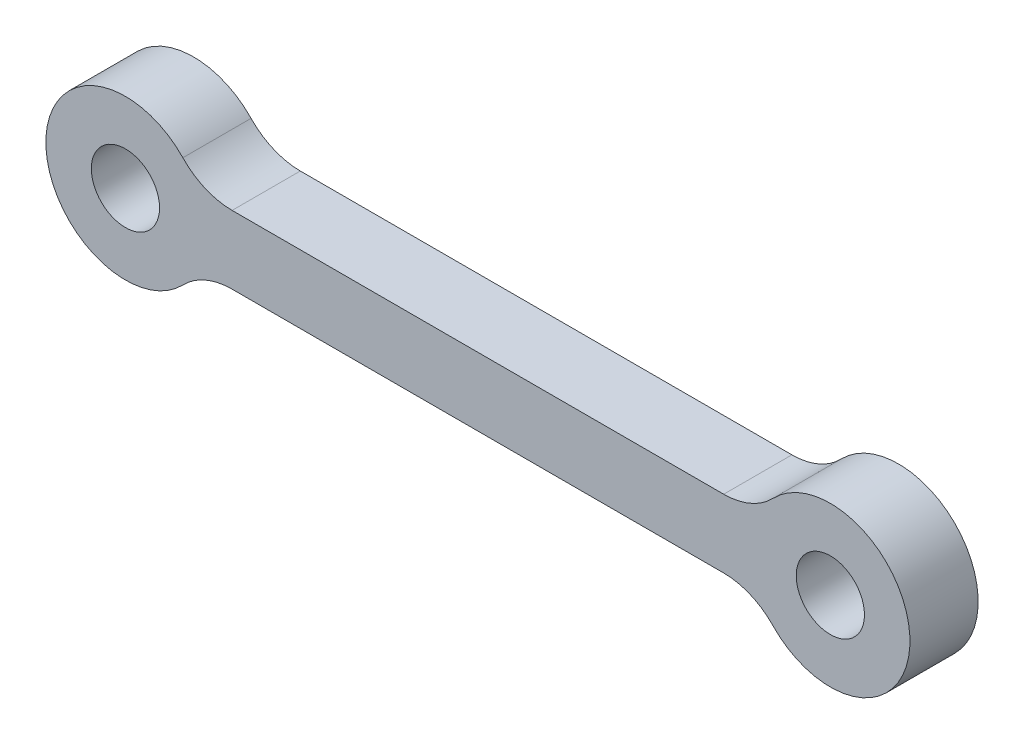
ISO-10303-21;
HEADER;
FILE_DESCRIPTION(('STEP AP214'),'2;1');
FILE_NAME('part.step','',(''),(''),'','','');
FILE_SCHEMA(('AUTOMOTIVE_DESIGN { 1 0 10303 214 1 1 1 1 }'));
ENDSEC;
DATA;
#1=APPLICATION_CONTEXT('core data for automotive mechanical design processes');
#2=APPLICATION_PROTOCOL_DEFINITION('international standard','automotive_design',2000,#1);
#3=PRODUCT_CONTEXT('',#1,'mechanical');
#4=PRODUCT('Part','Part','',(#3));
#5=PRODUCT_RELATED_PRODUCT_CATEGORY('part','',(#4));
#6=PRODUCT_DEFINITION_FORMATION('','',#4);
#7=PRODUCT_DEFINITION_CONTEXT('part definition',#1,'design');
#8=PRODUCT_DEFINITION('design','',#6,#7);
#9=PRODUCT_DEFINITION_SHAPE('','',#8);
#10=(LENGTH_UNIT() NAMED_UNIT(*) SI_UNIT(.MILLI.,.METRE.));
#11=(NAMED_UNIT(*) PLANE_ANGLE_UNIT() SI_UNIT($,.RADIAN.));
#12=(NAMED_UNIT(*) SI_UNIT($,.STERADIAN.) SOLID_ANGLE_UNIT());
#13=UNCERTAINTY_MEASURE_WITH_UNIT(LENGTH_MEASURE(1.E-05),#10,'distance_accuracy_value','');
#14=(GEOMETRIC_REPRESENTATION_CONTEXT(3) GLOBAL_UNCERTAINTY_ASSIGNED_CONTEXT((#13)) GLOBAL_UNIT_ASSIGNED_CONTEXT((#10,
#11,#12)) REPRESENTATION_CONTEXT('',''));
#15=CARTESIAN_POINT('',(0.,0.,0.));
#16=DIRECTION('',(0.,0.,1.));
#17=DIRECTION('',(1.,0.,0.));
#18=AXIS2_PLACEMENT_3D('',#15,#16,#17);
#19=CARTESIAN_POINT('',(0.,-1.5,3.));
#20=DIRECTION('',(0.,-1.,0.));
#21=DIRECTION('',(1.,0.,0.));
#22=AXIS2_PLACEMENT_3D('',#19,#20,#21);
#23=PLANE('',#22);
#24=DIRECTION('',(-1.,0.,0.));
#25=VECTOR('',#24,1.);
#26=CARTESIAN_POINT('',(0.,-1.5,0.));
#27=LINE('',#26,#25);
#28=CARTESIAN_POINT('',(10.8095842401766,-1.5,0.));
#29=VERTEX_POINT('',#28);
#30=CARTESIAN_POINT('',(-10.8095842401766,-1.5,0.));
#31=VERTEX_POINT('',#30);
#32=EDGE_CURVE('E136',#29,#31,#27,.T.);
#33=ORIENTED_EDGE('',*,*,#32,.F.);
#34=DIRECTION('',(0.,0.,-1.));
#35=VECTOR('',#34,1.);
#36=CARTESIAN_POINT('',(10.8095842401766,-1.5,3.));
#37=LINE('',#36,#35);
#38=CARTESIAN_POINT('',(10.8095842401766,-1.5,3.));
#39=VERTEX_POINT('',#38);
#40=EDGE_CURVE('E58',#29,#39,#37,.F.);
#41=ORIENTED_EDGE('',*,*,#40,.T.);
#42=DIRECTION('',(-1.,0.,0.));
#43=VECTOR('',#42,1.);
#44=CARTESIAN_POINT('',(0.,-1.5,3.));
#45=LINE('',#44,#43);
#46=CARTESIAN_POINT('',(-10.8095842401766,-1.5,3.));
#47=VERTEX_POINT('',#46);
#48=EDGE_CURVE('E145',#39,#47,#45,.T.);
#49=ORIENTED_EDGE('',*,*,#48,.T.);
#50=DIRECTION('',(0.,0.,-1.));
#51=VECTOR('',#50,1.);
#52=CARTESIAN_POINT('',(-10.8095842401766,-1.5,3.));
#53=LINE('',#52,#51);
#54=EDGE_CURVE('E156',#47,#31,#53,.T.);
#55=ORIENTED_EDGE('',*,*,#54,.T.);
#56=EDGE_LOOP('',(#33,#41,#49,#55));
#57=FACE_BOUND('',#56,.T.);
#58=ADVANCED_FACE('F38',(#57),#23,.T.);
#59=CARTESIAN_POINT('',(15.5,0.,3.));
#60=DIRECTION('',(0.,0.,-1.));
#61=DIRECTION('',(-1.,0.,0.));
#62=AXIS2_PLACEMENT_3D('',#59,#60,#61);
#63=CYLINDRICAL_SURFACE('',#62,3.5);
#64=CARTESIAN_POINT('',(15.5,0.,0.));
#65=DIRECTION('',(0.,0.,1.));
#66=DIRECTION('',(1.,0.,0.));
#67=AXIS2_PLACEMENT_3D('',#64,#65,#66);
#68=CIRCLE('',#67,3.5);
#69=CARTESIAN_POINT('',(12.9743915139412,-2.42307692307692,0.));
#70=VERTEX_POINT('',#69);
#71=CARTESIAN_POINT('',(12.9743915139412,2.42307692307692,0.));
#72=VERTEX_POINT('',#71);
#73=EDGE_CURVE('E131',#70,#72,#68,.T.);
#74=ORIENTED_EDGE('',*,*,#73,.T.);
#75=DIRECTION('',(0.,0.,-1.));
#76=VECTOR('',#75,1.);
#77=CARTESIAN_POINT('',(12.9743915139412,2.42307692307692,3.));
#78=LINE('',#77,#76);
#79=CARTESIAN_POINT('',(12.9743915139412,2.42307692307692,3.));
#80=VERTEX_POINT('',#79);
#81=EDGE_CURVE('E108',#72,#80,#78,.F.);
#82=ORIENTED_EDGE('',*,*,#81,.T.);
#83=CARTESIAN_POINT('',(15.5,0.,3.));
#84=DIRECTION('',(0.,0.,1.));
#85=DIRECTION('',(1.,0.,0.));
#86=AXIS2_PLACEMENT_3D('',#83,#84,#85);
#87=CIRCLE('',#86,3.5);
#88=CARTESIAN_POINT('',(12.9743915139412,-2.42307692307692,3.));
#89=VERTEX_POINT('',#88);
#90=EDGE_CURVE('E176',#89,#80,#87,.T.);
#91=ORIENTED_EDGE('',*,*,#90,.F.);
#92=DIRECTION('',(0.,0.,-1.));
#93=VECTOR('',#92,1.);
#94=CARTESIAN_POINT('',(12.9743915139412,-2.42307692307692,3.));
#95=LINE('',#94,#93);
#96=EDGE_CURVE('E123',#89,#70,#95,.T.);
#97=ORIENTED_EDGE('',*,*,#96,.T.);
#98=EDGE_LOOP('',(#74,#82,#91,#97));
#99=FACE_BOUND('',#98,.T.);
#100=ADVANCED_FACE('F204',(#99),#63,.T.);
#101=CARTESIAN_POINT('',(0.,1.5,3.));
#102=DIRECTION('',(0.,-1.,0.));
#103=DIRECTION('',(1.,0.,0.));
#104=AXIS2_PLACEMENT_3D('',#101,#102,#103);
#105=PLANE('',#104);
#106=DIRECTION('',(-1.,0.,0.));
#107=VECTOR('',#106,1.);
#108=CARTESIAN_POINT('',(0.,1.5,3.));
#109=LINE('',#108,#107);
#110=CARTESIAN_POINT('',(10.8095842401766,1.5,3.));
#111=VERTEX_POINT('',#110);
#112=CARTESIAN_POINT('',(-10.8095842401766,1.5,3.));
#113=VERTEX_POINT('',#112);
#114=EDGE_CURVE('E122',#111,#113,#109,.T.);
#115=ORIENTED_EDGE('',*,*,#114,.F.);
#116=DIRECTION('',(0.,0.,1.));
#117=VECTOR('',#116,1.);
#118=CARTESIAN_POINT('',(10.8095842401766,1.5,0.));
#119=LINE('',#118,#117);
#120=CARTESIAN_POINT('',(10.8095842401766,1.5,0.));
#121=VERTEX_POINT('',#120);
#122=EDGE_CURVE('E107',#111,#121,#119,.F.);
#123=ORIENTED_EDGE('',*,*,#122,.T.);
#124=DIRECTION('',(-1.,0.,0.));
#125=VECTOR('',#124,1.);
#126=CARTESIAN_POINT('',(0.,1.5,0.));
#127=LINE('',#126,#125);
#128=CARTESIAN_POINT('',(-10.8095842401766,1.5,0.));
#129=VERTEX_POINT('',#128);
#130=EDGE_CURVE('E119',#121,#129,#127,.T.);
#131=ORIENTED_EDGE('',*,*,#130,.T.);
#132=DIRECTION('',(0.,0.,1.));
#133=VECTOR('',#132,1.);
#134=CARTESIAN_POINT('',(-10.8095842401766,1.5,3.));
#135=LINE('',#134,#133);
#136=EDGE_CURVE('E124',#129,#113,#135,.T.);
#137=ORIENTED_EDGE('',*,*,#136,.T.);
#138=EDGE_LOOP('',(#115,#123,#131,#137));
#139=FACE_BOUND('',#138,.T.);
#140=ADVANCED_FACE('F118',(#139),#105,.F.);
#141=CARTESIAN_POINT('',(-15.5,0.,3.));
#142=DIRECTION('',(0.,0.,-1.));
#143=DIRECTION('',(-1.,0.,0.));
#144=AXIS2_PLACEMENT_3D('',#141,#142,#143);
#145=CYLINDRICAL_SURFACE('',#144,1.5);
#146=CARTESIAN_POINT('',(-15.5,0.,3.));
#147=DIRECTION('',(0.,0.,1.));
#148=DIRECTION('',(1.,0.,0.));
#149=AXIS2_PLACEMENT_3D('',#146,#147,#148);
#150=CIRCLE('',#149,1.5);
#151=CARTESIAN_POINT('',(-14.,0.,3.));
#152=VERTEX_POINT('',#151);
#153=EDGE_CURVE('E184',#152,#152,#150,.T.);
#154=ORIENTED_EDGE('',*,*,#153,.T.);
#155=EDGE_LOOP('',(#154));
#156=FACE_BOUND('',#155,.T.);
#157=CARTESIAN_POINT('',(-15.5,0.,0.));
#158=DIRECTION('',(0.,0.,1.));
#159=DIRECTION('',(1.,0.,0.));
#160=AXIS2_PLACEMENT_3D('',#157,#158,#159);
#161=CIRCLE('',#160,1.5);
#162=CARTESIAN_POINT('',(-14.,0.,0.));
#163=VERTEX_POINT('',#162);
#164=EDGE_CURVE('E134',#163,#163,#161,.T.);
#165=ORIENTED_EDGE('',*,*,#164,.F.);
#166=EDGE_LOOP('',(#165));
#167=FACE_BOUND('',#166,.T.);
#168=ADVANCED_FACE('F265',(#156,#167),#145,.F.);
#169=CARTESIAN_POINT('',(-15.5,0.,3.));
#170=DIRECTION('',(0.,0.,-1.));
#171=DIRECTION('',(-1.,0.,0.));
#172=AXIS2_PLACEMENT_3D('',#169,#170,#171);
#173=CYLINDRICAL_SURFACE('',#172,3.5);
#174=CARTESIAN_POINT('',(-15.5,0.,3.));
#175=DIRECTION('',(0.,0.,1.));
#176=DIRECTION('',(1.,0.,0.));
#177=AXIS2_PLACEMENT_3D('',#174,#175,#176);
#178=CIRCLE('',#177,3.5);
#179=CARTESIAN_POINT('',(-12.9743915139412,2.42307692307692,3.));
#180=VERTEX_POINT('',#179);
#181=CARTESIAN_POINT('',(-12.9743915139412,-2.42307692307693,3.));
#182=VERTEX_POINT('',#181);
#183=EDGE_CURVE('E182',#180,#182,#178,.T.);
#184=ORIENTED_EDGE('',*,*,#183,.F.);
#185=DIRECTION('',(0.,0.,-1.));
#186=VECTOR('',#185,1.);
#187=CARTESIAN_POINT('',(-12.9743915139412,2.42307692307692,3.));
#188=LINE('',#187,#186);
#189=CARTESIAN_POINT('',(-12.9743915139412,2.42307692307692,0.));
#190=VERTEX_POINT('',#189);
#191=EDGE_CURVE('E153',#180,#190,#188,.T.);
#192=ORIENTED_EDGE('',*,*,#191,.T.);
#193=CARTESIAN_POINT('',(-15.5,0.,0.));
#194=DIRECTION('',(0.,0.,1.));
#195=DIRECTION('',(1.,0.,0.));
#196=AXIS2_PLACEMENT_3D('',#193,#194,#195);
#197=CIRCLE('',#196,3.5);
#198=CARTESIAN_POINT('',(-12.9743915139412,-2.42307692307693,0.));
#199=VERTEX_POINT('',#198);
#200=EDGE_CURVE('E130',#190,#199,#197,.T.);
#201=ORIENTED_EDGE('',*,*,#200,.T.);
#202=DIRECTION('',(0.,0.,-1.));
#203=VECTOR('',#202,1.);
#204=CARTESIAN_POINT('',(-12.9743915139412,-2.42307692307693,3.));
#205=LINE('',#204,#203);
#206=EDGE_CURVE('E151',#199,#182,#205,.F.);
#207=ORIENTED_EDGE('',*,*,#206,.T.);
#208=EDGE_LOOP('',(#184,#192,#201,#207));
#209=FACE_BOUND('',#208,.T.);
#210=ADVANCED_FACE('F173',(#209),#173,.T.);
#211=CARTESIAN_POINT('',(15.5,0.,3.));
#212=DIRECTION('',(0.,0.,-1.));
#213=DIRECTION('',(-1.,0.,0.));
#214=AXIS2_PLACEMENT_3D('',#211,#212,#213);
#215=CYLINDRICAL_SURFACE('',#214,1.5);
#216=CARTESIAN_POINT('',(15.5,0.,3.));
#217=DIRECTION('',(0.,0.,1.));
#218=DIRECTION('',(1.,0.,0.));
#219=AXIS2_PLACEMENT_3D('',#216,#217,#218);
#220=CIRCLE('',#219,1.5);
#221=CARTESIAN_POINT('',(17.,0.,3.));
#222=VERTEX_POINT('',#221);
#223=EDGE_CURVE('E146',#222,#222,#220,.T.);
#224=ORIENTED_EDGE('',*,*,#223,.T.);
#225=EDGE_LOOP('',(#224));
#226=FACE_BOUND('',#225,.T.);
#227=CARTESIAN_POINT('',(15.5,0.,0.));
#228=DIRECTION('',(0.,0.,1.));
#229=DIRECTION('',(1.,0.,0.));
#230=AXIS2_PLACEMENT_3D('',#227,#228,#229);
#231=CIRCLE('',#230,1.5);
#232=CARTESIAN_POINT('',(17.,0.,0.));
#233=VERTEX_POINT('',#232);
#234=EDGE_CURVE('E142',#233,#233,#231,.T.);
#235=ORIENTED_EDGE('',*,*,#234,.F.);
#236=EDGE_LOOP('',(#235));
#237=FACE_BOUND('',#236,.T.);
#238=ADVANCED_FACE('F190',(#226,#237),#215,.F.);
#239=CARTESIAN_POINT('',(0.,0.,3.));
#240=DIRECTION('',(0.,0.,1.));
#241=DIRECTION('',(1.,0.,0.));
#242=AXIS2_PLACEMENT_3D('',#239,#240,#241);
#243=PLANE('',#242);
#244=ORIENTED_EDGE('',*,*,#48,.F.);
#245=CARTESIAN_POINT('',(10.8095842401766,-4.5,3.));
#246=DIRECTION('',(0.,0.,1.));
#247=DIRECTION('',(1.,0.,0.));
#248=AXIS2_PLACEMENT_3D('',#245,#246,#247);
#249=CIRCLE('',#248,3.);
#250=EDGE_CURVE('E166',#39,#89,#249,.F.);
#251=ORIENTED_EDGE('',*,*,#250,.T.);
#252=ORIENTED_EDGE('',*,*,#90,.T.);
#253=CARTESIAN_POINT('',(10.8095842401766,4.5,3.));
#254=DIRECTION('',(0.,0.,1.));
#255=DIRECTION('',(1.,0.,0.));
#256=AXIS2_PLACEMENT_3D('',#253,#254,#255);
#257=CIRCLE('',#256,3.);
#258=EDGE_CURVE('E113',#80,#111,#257,.F.);
#259=ORIENTED_EDGE('',*,*,#258,.T.);
#260=ORIENTED_EDGE('',*,*,#114,.T.);
#261=CARTESIAN_POINT('',(-10.8095842401766,4.5,3.));
#262=DIRECTION('',(0.,0.,1.));
#263=DIRECTION('',(1.,0.,0.));
#264=AXIS2_PLACEMENT_3D('',#261,#262,#263);
#265=CIRCLE('',#264,3.);
#266=EDGE_CURVE('E162',#113,#180,#265,.F.);
#267=ORIENTED_EDGE('',*,*,#266,.T.);
#268=ORIENTED_EDGE('',*,*,#183,.T.);
#269=CARTESIAN_POINT('',(-10.8095842401766,-4.5,3.));
#270=DIRECTION('',(0.,0.,1.));
#271=DIRECTION('',(1.,0.,0.));
#272=AXIS2_PLACEMENT_3D('',#269,#270,#271);
#273=CIRCLE('',#272,3.);
#274=EDGE_CURVE('E11',#182,#47,#273,.F.);
#275=ORIENTED_EDGE('',*,*,#274,.T.);
#276=EDGE_LOOP('',(#244,#251,#252,#259,#260,#267,#268,#275));
#277=FACE_BOUND('',#276,.T.);
#278=ORIENTED_EDGE('',*,*,#153,.F.);
#279=EDGE_LOOP('',(#278));
#280=FACE_BOUND('',#279,.T.);
#281=ORIENTED_EDGE('',*,*,#223,.F.);
#282=EDGE_LOOP('',(#281));
#283=FACE_BOUND('',#282,.T.);
#284=ADVANCED_FACE('F193',(#277,#280,#283),#243,.T.);
#285=CARTESIAN_POINT('',(0.,0.,0.));
#286=DIRECTION('',(0.,0.,1.));
#287=DIRECTION('',(1.,0.,0.));
#288=AXIS2_PLACEMENT_3D('',#285,#286,#287);
#289=PLANE('',#288);
#290=ORIENTED_EDGE('',*,*,#73,.F.);
#291=CARTESIAN_POINT('',(10.8095842401766,-4.5,0.));
#292=DIRECTION('',(0.,0.,1.));
#293=DIRECTION('',(1.,0.,0.));
#294=AXIS2_PLACEMENT_3D('',#291,#292,#293);
#295=CIRCLE('',#294,3.);
#296=EDGE_CURVE('E164',#70,#29,#295,.T.);
#297=ORIENTED_EDGE('',*,*,#296,.T.);
#298=ORIENTED_EDGE('',*,*,#32,.T.);
#299=CARTESIAN_POINT('',(-10.8095842401766,-4.5,0.));
#300=DIRECTION('',(0.,0.,1.));
#301=DIRECTION('',(1.,0.,0.));
#302=AXIS2_PLACEMENT_3D('',#299,#300,#301);
#303=CIRCLE('',#302,3.);
#304=EDGE_CURVE('E46',#31,#199,#303,.T.);
#305=ORIENTED_EDGE('',*,*,#304,.T.);
#306=ORIENTED_EDGE('',*,*,#200,.F.);
#307=CARTESIAN_POINT('',(-10.8095842401766,4.5,0.));
#308=DIRECTION('',(0.,0.,1.));
#309=DIRECTION('',(1.,0.,0.));
#310=AXIS2_PLACEMENT_3D('',#307,#308,#309);
#311=CIRCLE('',#310,3.);
#312=EDGE_CURVE('E129',#190,#129,#311,.T.);
#313=ORIENTED_EDGE('',*,*,#312,.T.);
#314=ORIENTED_EDGE('',*,*,#130,.F.);
#315=CARTESIAN_POINT('',(10.8095842401766,4.5,0.));
#316=DIRECTION('',(0.,0.,1.));
#317=DIRECTION('',(1.,0.,0.));
#318=AXIS2_PLACEMENT_3D('',#315,#316,#317);
#319=CIRCLE('',#318,3.);
#320=EDGE_CURVE('E103',#121,#72,#319,.T.);
#321=ORIENTED_EDGE('',*,*,#320,.T.);
#322=EDGE_LOOP('',(#290,#297,#298,#305,#306,#313,#314,#321));
#323=FACE_BOUND('',#322,.T.);
#324=ORIENTED_EDGE('',*,*,#164,.T.);
#325=EDGE_LOOP('',(#324));
#326=FACE_BOUND('',#325,.T.);
#327=ORIENTED_EDGE('',*,*,#234,.T.);
#328=EDGE_LOOP('',(#327));
#329=FACE_BOUND('',#328,.T.);
#330=ADVANCED_FACE('F126',(#323,#326,#329),#289,.F.);
#331=CARTESIAN_POINT('',(10.8095842401766,4.5,3.));
#332=DIRECTION('',(0.,0.,-1.));
#333=DIRECTION('',(-1.,0.,0.));
#334=AXIS2_PLACEMENT_3D('',#331,#332,#333);
#335=CYLINDRICAL_SURFACE('',#334,3.);
#336=ORIENTED_EDGE('',*,*,#258,.F.);
#337=ORIENTED_EDGE('',*,*,#81,.F.);
#338=ORIENTED_EDGE('',*,*,#320,.F.);
#339=ORIENTED_EDGE('',*,*,#122,.F.);
#340=EDGE_LOOP('',(#336,#337,#338,#339));
#341=FACE_BOUND('',#340,.T.);
#342=ADVANCED_FACE('F106',(#341),#335,.F.);
#343=CARTESIAN_POINT('',(-10.8095842401766,4.5,3.));
#344=DIRECTION('',(0.,0.,-1.));
#345=DIRECTION('',(-1.,0.,0.));
#346=AXIS2_PLACEMENT_3D('',#343,#344,#345);
#347=CYLINDRICAL_SURFACE('',#346,3.);
#348=ORIENTED_EDGE('',*,*,#266,.F.);
#349=ORIENTED_EDGE('',*,*,#136,.F.);
#350=ORIENTED_EDGE('',*,*,#312,.F.);
#351=ORIENTED_EDGE('',*,*,#191,.F.);
#352=EDGE_LOOP('',(#348,#349,#350,#351));
#353=FACE_BOUND('',#352,.T.);
#354=ADVANCED_FACE('F215',(#353),#347,.F.);
#355=CARTESIAN_POINT('',(10.8095842401766,-4.5,3.));
#356=DIRECTION('',(0.,0.,-1.));
#357=DIRECTION('',(-1.,0.,0.));
#358=AXIS2_PLACEMENT_3D('',#355,#356,#357);
#359=CYLINDRICAL_SURFACE('',#358,3.);
#360=ORIENTED_EDGE('',*,*,#250,.F.);
#361=ORIENTED_EDGE('',*,*,#40,.F.);
#362=ORIENTED_EDGE('',*,*,#296,.F.);
#363=ORIENTED_EDGE('',*,*,#96,.F.);
#364=EDGE_LOOP('',(#360,#361,#362,#363));
#365=FACE_BOUND('',#364,.T.);
#366=ADVANCED_FACE('F217',(#365),#359,.F.);
#367=CARTESIAN_POINT('',(-10.8095842401766,-4.5,3.));
#368=DIRECTION('',(0.,0.,-1.));
#369=DIRECTION('',(-1.,0.,0.));
#370=AXIS2_PLACEMENT_3D('',#367,#368,#369);
#371=CYLINDRICAL_SURFACE('',#370,3.);
#372=ORIENTED_EDGE('',*,*,#274,.F.);
#373=ORIENTED_EDGE('',*,*,#206,.F.);
#374=ORIENTED_EDGE('',*,*,#304,.F.);
#375=ORIENTED_EDGE('',*,*,#54,.F.);
#376=EDGE_LOOP('',(#372,#373,#374,#375));
#377=FACE_BOUND('',#376,.T.);
#378=ADVANCED_FACE('F40',(#377),#371,.F.);
#379=CLOSED_SHELL('',(#58,#100,#140,#168,#210,#238,#284,#330,#342,#354,#366,#378));
#380=MANIFOLD_SOLID_BREP('B2',#379);
#381=ADVANCED_BREP_SHAPE_REPRESENTATION('',(#18,#380),#14);
#382=SHAPE_DEFINITION_REPRESENTATION(#9,#381);
ENDSEC;
END-ISO-10303-21;
